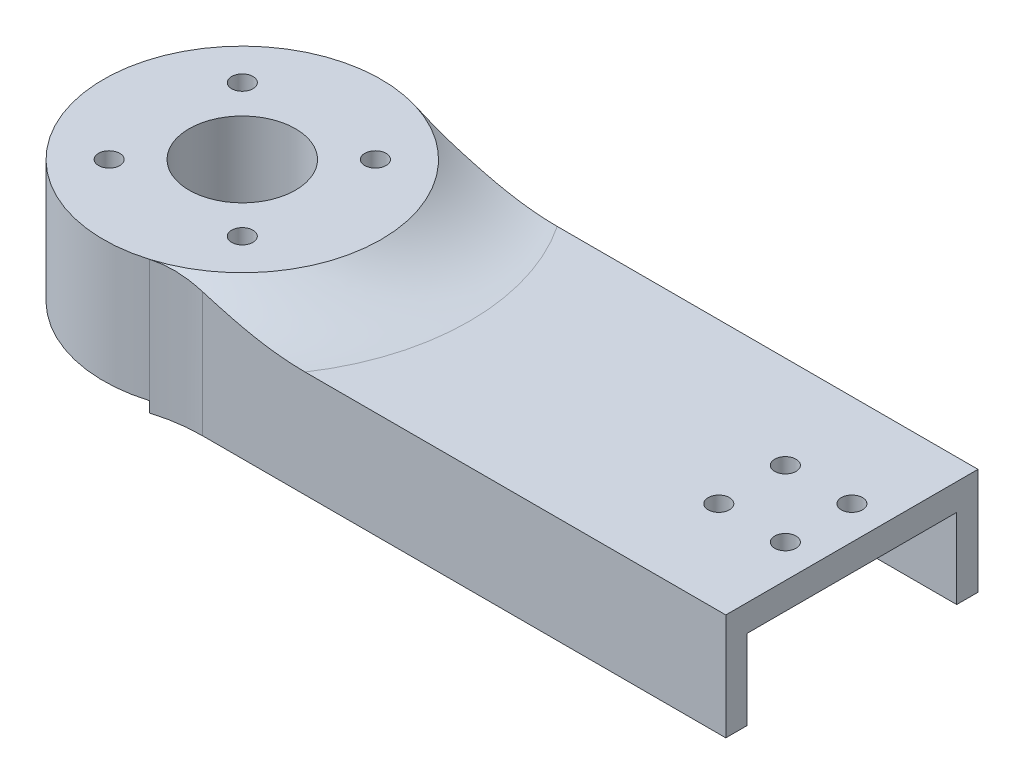
ISO-10303-21;
HEADER;
FILE_DESCRIPTION(('STEP AP214'),'2;1');
FILE_NAME('part.step','',(''),(''),'','','');
FILE_SCHEMA(('AUTOMOTIVE_DESIGN { 1 0 10303 214 1 1 1 1 }'));
ENDSEC;
DATA;
#1=APPLICATION_CONTEXT('core data for automotive mechanical design processes');
#2=APPLICATION_PROTOCOL_DEFINITION('international standard','automotive_design',2000,#1);
#3=PRODUCT_CONTEXT('',#1,'mechanical');
#4=PRODUCT('Part','Part','',(#3));
#5=PRODUCT_RELATED_PRODUCT_CATEGORY('part','',(#4));
#6=PRODUCT_DEFINITION_FORMATION('','',#4);
#7=PRODUCT_DEFINITION_CONTEXT('part definition',#1,'design');
#8=PRODUCT_DEFINITION('design','',#6,#7);
#9=PRODUCT_DEFINITION_SHAPE('','',#8);
#10=(LENGTH_UNIT() NAMED_UNIT(*) SI_UNIT(.MILLI.,.METRE.));
#11=(NAMED_UNIT(*) PLANE_ANGLE_UNIT() SI_UNIT($,.RADIAN.));
#12=(NAMED_UNIT(*) SI_UNIT($,.STERADIAN.) SOLID_ANGLE_UNIT());
#13=UNCERTAINTY_MEASURE_WITH_UNIT(LENGTH_MEASURE(1.E-05),#10,'distance_accuracy_value','');
#14=(GEOMETRIC_REPRESENTATION_CONTEXT(3) GLOBAL_UNCERTAINTY_ASSIGNED_CONTEXT((#13)) GLOBAL_UNIT_ASSIGNED_CONTEXT((#10,
#11,#12)) REPRESENTATION_CONTEXT('',''));
#15=CARTESIAN_POINT('',(0.,0.,0.));
#16=DIRECTION('',(0.,0.,1.));
#17=DIRECTION('',(1.,0.,0.));
#18=AXIS2_PLACEMENT_3D('',#15,#16,#17);
#19=CARTESIAN_POINT('',(0.,40.,0.));
#20=DIRECTION('',(0.,-1.,0.));
#21=DIRECTION('',(0.,0.,1.));
#22=AXIS2_PLACEMENT_3D('',#19,#20,#21);
#23=PLANE('',#22);
#24=CARTESIAN_POINT('',(-61.1993827291588,40.,0.));
#25=DIRECTION('',(0.,-1.,0.));
#26=DIRECTION('',(0.,0.,-1.));
#27=AXIS2_PLACEMENT_3D('',#24,#25,#26);
#28=CIRCLE('',#27,26.0715061656139);
#29=CARTESIAN_POINT('',(-53.6728775906691,40.,-24.9614733968956));
#30=VERTEX_POINT('',#29);
#31=CARTESIAN_POINT('',(-44.1038709714179,40.,-19.6841792179553));
#32=VERTEX_POINT('',#31);
#33=EDGE_CURVE('E140',#30,#32,#28,.T.);
#34=ORIENTED_EDGE('',*,*,#33,.F.);
#35=CARTESIAN_POINT('',(-45.0122673167412,40.,-53.6841792179553));
#36=DIRECTION('',(0.,1.,0.));
#37=DIRECTION('',(0.,0.,1.));
#38=AXIS2_PLACEMENT_3D('',#35,#36,#37);
#39=CIRCLE('',#38,30.);
#40=CARTESIAN_POINT('',(-45.0122673167412,40.,-23.6841792179553));
#41=VERTEX_POINT('',#40);
#42=EDGE_CURVE('E52',#41,#30,#39,.F.);
#43=ORIENTED_EDGE('',*,*,#42,.F.);
#44=DIRECTION('',(-1.,0.,0.));
#45=VECTOR('',#44,1.);
#46=CARTESIAN_POINT('',(-50.3006172708412,40.,-23.6841792179553));
#47=LINE('',#46,#45);
#48=CARTESIAN_POINT('',(53.3006172708412,40.,-23.6841792179553));
#49=VERTEX_POINT('',#48);
#50=EDGE_CURVE('E248',#49,#41,#47,.T.);
#51=ORIENTED_EDGE('',*,*,#50,.F.);
#52=DIRECTION('',(0.,0.,1.));
#53=VECTOR('',#52,1.);
#54=CARTESIAN_POINT('',(53.3006172708412,40.,-19.6841792179553));
#55=LINE('',#54,#53);
#56=CARTESIAN_POINT('',(53.3006172708412,40.,-19.6841792179553));
#57=VERTEX_POINT('',#56);
#58=EDGE_CURVE('E275',#49,#57,#55,.T.);
#59=ORIENTED_EDGE('',*,*,#58,.T.);
#60=DIRECTION('',(1.,0.,0.));
#61=VECTOR('',#60,1.);
#62=CARTESIAN_POINT('',(-50.3006172708412,40.,-19.6841792179553));
#63=LINE('',#62,#61);
#64=EDGE_CURVE('E153',#32,#57,#63,.T.);
#65=ORIENTED_EDGE('',*,*,#64,.F.);
#66=EDGE_LOOP('',(#34,#43,#51,#59,#65));
#67=FACE_BOUND('',#66,.T.);
#68=ADVANCED_FACE('F42',(#67),#23,.T.);
#69=CARTESIAN_POINT('',(-61.1993827291588,65.,0.));
#70=DIRECTION('',(0.,-1.,0.));
#71=DIRECTION('',(0.,0.,1.));
#72=AXIS2_PLACEMENT_3D('',#69,#70,#71);
#73=CYLINDRICAL_SURFACE('',#72,26.0715061656139);
#74=DIRECTION('',(0.,-1.,0.));
#75=VECTOR('',#74,1.);
#76=CARTESIAN_POINT('',(-53.6728775906691,65.,-24.9614733968957));
#77=LINE('',#76,#75);
#78=CARTESIAN_POINT('',(-53.6728775906691,42.,-24.9614733968957));
#79=VERTEX_POINT('',#78);
#80=CARTESIAN_POINT('',(-53.6728775906691,65.,-24.9614733968956));
#81=VERTEX_POINT('',#80);
#82=EDGE_CURVE('E145',#79,#81,#77,.F.);
#83=ORIENTED_EDGE('',*,*,#82,.F.);
#84=CARTESIAN_POINT('',(-61.1993827291588,42.,0.));
#85=DIRECTION('',(0.,-1.,0.));
#86=DIRECTION('',(0.,0.,-1.));
#87=AXIS2_PLACEMENT_3D('',#84,#85,#86);
#88=CIRCLE('',#87,26.0715061656139);
#89=CARTESIAN_POINT('',(-53.6728775906691,42.,24.9614733968956));
#90=VERTEX_POINT('',#89);
#91=EDGE_CURVE('E154',#90,#79,#88,.T.);
#92=ORIENTED_EDGE('',*,*,#91,.F.);
#93=DIRECTION('',(0.,-1.,0.));
#94=VECTOR('',#93,1.);
#95=CARTESIAN_POINT('',(-53.6728775906691,65.,24.9614733968956));
#96=LINE('',#95,#94);
#97=CARTESIAN_POINT('',(-53.6728775906691,65.,24.9614733968956));
#98=VERTEX_POINT('',#97);
#99=EDGE_CURVE('E226',#98,#90,#96,.T.);
#100=ORIENTED_EDGE('',*,*,#99,.F.);
#101=CARTESIAN_POINT('',(-61.1993827291588,65.,0.));
#102=DIRECTION('',(0.,1.,0.));
#103=DIRECTION('',(0.,0.,1.));
#104=AXIS2_PLACEMENT_3D('',#101,#102,#103);
#105=CIRCLE('',#104,26.0715061656139);
#106=EDGE_CURVE('E265',#81,#98,#105,.T.);
#107=ORIENTED_EDGE('',*,*,#106,.F.);
#108=EDGE_LOOP('',(#83,#92,#100,#107));
#109=FACE_BOUND('',#108,.T.);
#110=ADVANCED_FACE('F339',(#109),#73,.T.);
#111=DIRECTION('',(0.,-1.,0.));
#112=VECTOR('',#111,1.);
#113=CARTESIAN_POINT('',(-44.1038709714179,65.,19.6841792179553));
#114=LINE('',#113,#112);
#115=CARTESIAN_POINT('',(-44.1038709714179,42.,19.6841792179553));
#116=VERTEX_POINT('',#115);
#117=CARTESIAN_POINT('',(-44.1038709714179,55.,19.6841792179553));
#118=VERTEX_POINT('',#117);
#119=EDGE_CURVE('E256',#116,#118,#114,.F.);
#120=ORIENTED_EDGE('',*,*,#119,.F.);
#121=CARTESIAN_POINT('',(-44.1038709714179,42.,-19.6841792179553));
#122=VERTEX_POINT('',#121);
#123=EDGE_CURVE('E313',#122,#116,#88,.T.);
#124=ORIENTED_EDGE('',*,*,#123,.F.);
#125=DIRECTION('',(0.,-1.,0.));
#126=VECTOR('',#125,1.);
#127=CARTESIAN_POINT('',(-44.1038709714179,65.,-19.6841792179553));
#128=LINE('',#127,#126);
#129=CARTESIAN_POINT('',(-44.1038709714179,55.,-19.6841792179553));
#130=VERTEX_POINT('',#129);
#131=EDGE_CURVE('E259',#130,#122,#128,.T.);
#132=ORIENTED_EDGE('',*,*,#131,.F.);
#133=CARTESIAN_POINT('',(-61.1993827291588,55.,0.));
#134=DIRECTION('',(0.,1.,0.));
#135=DIRECTION('',(0.,0.,1.));
#136=AXIS2_PLACEMENT_3D('',#133,#134,#135);
#137=CIRCLE('',#136,26.0715061656139);
#138=EDGE_CURVE('E257',#118,#130,#137,.T.);
#139=ORIENTED_EDGE('',*,*,#138,.F.);
#140=EDGE_LOOP('',(#120,#124,#132,#139));
#141=FACE_BOUND('',#140,.T.);
#142=ADVANCED_FACE('F350',(#141),#73,.T.);
#143=CARTESIAN_POINT('',(-48.6993827291588,66.89954427596,-12.5));
#144=DIRECTION('',(0.,-1.,0.));
#145=DIRECTION('',(0.,0.,1.));
#146=AXIS2_PLACEMENT_3D('',#143,#144,#145);
#147=CYLINDRICAL_SURFACE('',#146,1.99999999999998);
#148=CARTESIAN_POINT('',(-48.6993827291588,65.,-12.5));
#149=DIRECTION('',(0.,1.,0.));
#150=DIRECTION('',(0.,0.,1.));
#151=AXIS2_PLACEMENT_3D('',#148,#149,#150);
#152=CIRCLE('',#151,1.99999999999998);
#153=CARTESIAN_POINT('',(-48.6993827291588,65.,-10.5));
#154=VERTEX_POINT('',#153);
#155=EDGE_CURVE('E741',#154,#154,#152,.T.);
#156=ORIENTED_EDGE('',*,*,#155,.T.);
#157=EDGE_LOOP('',(#156));
#158=FACE_BOUND('',#157,.T.);
#159=CARTESIAN_POINT('',(-48.6993827291588,42.,-12.5));
#160=DIRECTION('',(0.,-1.,0.));
#161=DIRECTION('',(0.,0.,-1.));
#162=AXIS2_PLACEMENT_3D('',#159,#160,#161);
#163=CIRCLE('',#162,1.99999999999998);
#164=CARTESIAN_POINT('',(-48.6993827291588,42.,-14.5));
#165=VERTEX_POINT('',#164);
#166=EDGE_CURVE('E303',#165,#165,#163,.F.);
#167=ORIENTED_EDGE('',*,*,#166,.F.);
#168=EDGE_LOOP('',(#167));
#169=FACE_BOUND('',#168,.T.);
#170=ADVANCED_FACE('F376',(#158,#169),#147,.F.);
#171=CARTESIAN_POINT('',(-48.6993827291588,66.89954427596,12.5));
#172=DIRECTION('',(0.,-1.,0.));
#173=DIRECTION('',(0.,0.,1.));
#174=AXIS2_PLACEMENT_3D('',#171,#172,#173);
#175=CYLINDRICAL_SURFACE('',#174,1.99999999999997);
#176=CARTESIAN_POINT('',(-48.6993827291588,65.,12.5));
#177=DIRECTION('',(0.,1.,0.));
#178=DIRECTION('',(0.,0.,1.));
#179=AXIS2_PLACEMENT_3D('',#176,#177,#178);
#180=CIRCLE('',#179,1.99999999999997);
#181=CARTESIAN_POINT('',(-48.6993827291588,65.,14.5));
#182=VERTEX_POINT('',#181);
#183=EDGE_CURVE('E744',#182,#182,#180,.T.);
#184=ORIENTED_EDGE('',*,*,#183,.T.);
#185=EDGE_LOOP('',(#184));
#186=FACE_BOUND('',#185,.T.);
#187=CARTESIAN_POINT('',(-48.6993827291588,42.,12.5));
#188=DIRECTION('',(0.,-1.,0.));
#189=DIRECTION('',(0.,0.,-1.));
#190=AXIS2_PLACEMENT_3D('',#187,#188,#189);
#191=CIRCLE('',#190,1.99999999999997);
#192=CARTESIAN_POINT('',(-48.6993827291588,42.,10.5));
#193=VERTEX_POINT('',#192);
#194=EDGE_CURVE('E306',#193,#193,#191,.F.);
#195=ORIENTED_EDGE('',*,*,#194,.F.);
#196=EDGE_LOOP('',(#195));
#197=FACE_BOUND('',#196,.T.);
#198=ADVANCED_FACE('F383',(#186,#197),#175,.F.);
#199=CARTESIAN_POINT('',(-73.6993827291588,66.89954427596,12.5));
#200=DIRECTION('',(0.,-1.,0.));
#201=DIRECTION('',(0.,0.,1.));
#202=AXIS2_PLACEMENT_3D('',#199,#200,#201);
#203=CYLINDRICAL_SURFACE('',#202,2.);
#204=CARTESIAN_POINT('',(-73.6993827291588,65.,12.5));
#205=DIRECTION('',(0.,1.,0.));
#206=DIRECTION('',(0.,0.,1.));
#207=AXIS2_PLACEMENT_3D('',#204,#205,#206);
#208=CIRCLE('',#207,2.);
#209=CARTESIAN_POINT('',(-73.6993827291588,65.,14.5));
#210=VERTEX_POINT('',#209);
#211=EDGE_CURVE('E748',#210,#210,#208,.T.);
#212=ORIENTED_EDGE('',*,*,#211,.T.);
#213=EDGE_LOOP('',(#212));
#214=FACE_BOUND('',#213,.T.);
#215=CARTESIAN_POINT('',(-73.6993827291588,42.,12.5));
#216=DIRECTION('',(0.,-1.,0.));
#217=DIRECTION('',(0.,0.,-1.));
#218=AXIS2_PLACEMENT_3D('',#215,#216,#217);
#219=CIRCLE('',#218,2.);
#220=CARTESIAN_POINT('',(-73.6993827291588,42.,10.5));
#221=VERTEX_POINT('',#220);
#222=EDGE_CURVE('E309',#221,#221,#219,.F.);
#223=ORIENTED_EDGE('',*,*,#222,.F.);
#224=EDGE_LOOP('',(#223));
#225=FACE_BOUND('',#224,.T.);
#226=ADVANCED_FACE('F387',(#214,#225),#203,.F.);
#227=CARTESIAN_POINT('',(-73.6993827291588,66.89954427596,-12.5));
#228=DIRECTION('',(0.,-1.,0.));
#229=DIRECTION('',(0.,0.,1.));
#230=AXIS2_PLACEMENT_3D('',#227,#228,#229);
#231=CYLINDRICAL_SURFACE('',#230,2.);
#232=CARTESIAN_POINT('',(-73.6993827291588,65.,-12.5));
#233=DIRECTION('',(0.,1.,0.));
#234=DIRECTION('',(0.,0.,1.));
#235=AXIS2_PLACEMENT_3D('',#232,#233,#234);
#236=CIRCLE('',#235,2.);
#237=CARTESIAN_POINT('',(-73.6993827291588,65.,-10.5));
#238=VERTEX_POINT('',#237);
#239=EDGE_CURVE('E284',#238,#238,#236,.T.);
#240=ORIENTED_EDGE('',*,*,#239,.T.);
#241=EDGE_LOOP('',(#240));
#242=FACE_BOUND('',#241,.T.);
#243=CARTESIAN_POINT('',(-73.6993827291588,42.,-12.5));
#244=DIRECTION('',(0.,-1.,0.));
#245=DIRECTION('',(0.,0.,-1.));
#246=AXIS2_PLACEMENT_3D('',#243,#244,#245);
#247=CIRCLE('',#246,2.);
#248=CARTESIAN_POINT('',(-73.6993827291588,42.,-14.5));
#249=VERTEX_POINT('',#248);
#250=EDGE_CURVE('E47',#249,#249,#247,.F.);
#251=ORIENTED_EDGE('',*,*,#250,.F.);
#252=EDGE_LOOP('',(#251));
#253=FACE_BOUND('',#252,.T.);
#254=ADVANCED_FACE('F196',(#242,#253),#231,.F.);
#255=CARTESIAN_POINT('',(0.,55.,0.));
#256=DIRECTION('',(0.,-1.,0.));
#257=DIRECTION('',(0.,0.,1.));
#258=AXIS2_PLACEMENT_3D('',#255,#256,#257);
#259=PLANE('',#258);
#260=CARTESIAN_POINT('',(34.5506172708412,55.,-6.25000000000001));
#261=DIRECTION('',(0.,-1.,0.));
#262=DIRECTION('',(0.,0.,1.));
#263=AXIS2_PLACEMENT_3D('',#260,#261,#262);
#264=CIRCLE('',#263,2.);
#265=CARTESIAN_POINT('',(34.5506172708412,55.,-4.25000000000001));
#266=VERTEX_POINT('',#265);
#267=EDGE_CURVE('E290',#266,#266,#264,.T.);
#268=ORIENTED_EDGE('',*,*,#267,.F.);
#269=EDGE_LOOP('',(#268));
#270=FACE_BOUND('',#269,.T.);
#271=CARTESIAN_POINT('',(47.0506172708412,55.,-6.25000000000001));
#272=DIRECTION('',(0.,-1.,0.));
#273=DIRECTION('',(0.,0.,-1.));
#274=AXIS2_PLACEMENT_3D('',#271,#272,#273);
#275=CIRCLE('',#274,2.);
#276=CARTESIAN_POINT('',(47.0506172708412,55.,-8.25));
#277=VERTEX_POINT('',#276);
#278=EDGE_CURVE('E293',#277,#277,#275,.T.);
#279=ORIENTED_EDGE('',*,*,#278,.F.);
#280=EDGE_LOOP('',(#279));
#281=FACE_BOUND('',#280,.T.);
#282=CARTESIAN_POINT('',(47.0506172708412,55.,6.25000000000001));
#283=DIRECTION('',(0.,-1.,0.));
#284=DIRECTION('',(0.,0.,1.));
#285=AXIS2_PLACEMENT_3D('',#282,#283,#284);
#286=CIRCLE('',#285,2.);
#287=CARTESIAN_POINT('',(47.0506172708412,55.,8.25));
#288=VERTEX_POINT('',#287);
#289=EDGE_CURVE('E289',#288,#288,#286,.T.);
#290=ORIENTED_EDGE('',*,*,#289,.F.);
#291=EDGE_LOOP('',(#290));
#292=FACE_BOUND('',#291,.T.);
#293=CARTESIAN_POINT('',(34.5506172708412,55.,6.25000000000001));
#294=DIRECTION('',(0.,-1.,0.));
#295=DIRECTION('',(0.,0.,-1.));
#296=AXIS2_PLACEMENT_3D('',#293,#294,#295);
#297=CIRCLE('',#296,2.);
#298=CARTESIAN_POINT('',(34.5506172708412,55.,4.25000000000001));
#299=VERTEX_POINT('',#298);
#300=EDGE_CURVE('E285',#299,#299,#297,.T.);
#301=ORIENTED_EDGE('',*,*,#300,.F.);
#302=EDGE_LOOP('',(#301));
#303=FACE_BOUND('',#302,.T.);
#304=ORIENTED_EDGE('',*,*,#138,.T.);
#305=DIRECTION('',(1.,0.,0.));
#306=VECTOR('',#305,1.);
#307=CARTESIAN_POINT('',(0.,55.,-19.6841792179553));
#308=LINE('',#307,#306);
#309=CARTESIAN_POINT('',(53.3006172708412,55.,-19.6841792179553));
#310=VERTEX_POINT('',#309);
#311=EDGE_CURVE('E235',#130,#310,#308,.T.);
#312=ORIENTED_EDGE('',*,*,#311,.T.);
#313=DIRECTION('',(0.,0.,1.));
#314=VECTOR('',#313,1.);
#315=CARTESIAN_POINT('',(53.3006172708412,55.,-19.6841792179553));
#316=LINE('',#315,#314);
#317=CARTESIAN_POINT('',(53.3006172708412,55.,19.6841792179553));
#318=VERTEX_POINT('',#317);
#319=EDGE_CURVE('E270',#310,#318,#316,.T.);
#320=ORIENTED_EDGE('',*,*,#319,.T.);
#321=DIRECTION('',(1.,0.,0.));
#322=VECTOR('',#321,1.);
#323=CARTESIAN_POINT('',(0.,55.,19.6841792179553));
#324=LINE('',#323,#322);
#325=EDGE_CURVE('E232',#118,#318,#324,.T.);
#326=ORIENTED_EDGE('',*,*,#325,.F.);
#327=EDGE_LOOP('',(#304,#312,#320,#326));
#328=FACE_BOUND('',#327,.T.);
#329=ADVANCED_FACE('F193',(#270,#281,#292,#303,#328),#259,.T.);
#330=CARTESIAN_POINT('',(0.,60.,0.));
#331=DIRECTION('',(0.,-1.,0.));
#332=DIRECTION('',(0.,0.,1.));
#333=AXIS2_PLACEMENT_3D('',#330,#331,#332);
#334=PLANE('',#333);
#335=CARTESIAN_POINT('',(34.5506172708412,60.,-6.25000000000001));
#336=DIRECTION('',(0.,-1.,0.));
#337=DIRECTION('',(0.,0.,-1.));
#338=AXIS2_PLACEMENT_3D('',#335,#336,#337);
#339=CIRCLE('',#338,2.);
#340=CARTESIAN_POINT('',(34.5506172708412,60.,-8.25));
#341=VERTEX_POINT('',#340);
#342=EDGE_CURVE('E732',#341,#341,#339,.T.);
#343=ORIENTED_EDGE('',*,*,#342,.T.);
#344=EDGE_LOOP('',(#343));
#345=FACE_BOUND('',#344,.T.);
#346=CARTESIAN_POINT('',(47.0506172708412,60.,-6.25000000000001));
#347=DIRECTION('',(0.,-1.,0.));
#348=DIRECTION('',(0.,0.,-1.));
#349=AXIS2_PLACEMENT_3D('',#346,#347,#348);
#350=CIRCLE('',#349,2.);
#351=CARTESIAN_POINT('',(47.0506172708412,60.,-8.25));
#352=VERTEX_POINT('',#351);
#353=EDGE_CURVE('E729',#352,#352,#350,.T.);
#354=ORIENTED_EDGE('',*,*,#353,.T.);
#355=EDGE_LOOP('',(#354));
#356=FACE_BOUND('',#355,.T.);
#357=CARTESIAN_POINT('',(47.0506172708412,60.,6.25000000000001));
#358=DIRECTION('',(0.,-1.,0.));
#359=DIRECTION('',(0.,0.,-1.));
#360=AXIS2_PLACEMENT_3D('',#357,#358,#359);
#361=CIRCLE('',#360,2.);
#362=CARTESIAN_POINT('',(47.0506172708412,60.,4.25000000000001));
#363=VERTEX_POINT('',#362);
#364=EDGE_CURVE('E727',#363,#363,#361,.T.);
#365=ORIENTED_EDGE('',*,*,#364,.T.);
#366=EDGE_LOOP('',(#365));
#367=FACE_BOUND('',#366,.T.);
#368=CARTESIAN_POINT('',(34.5506172708412,60.,6.25000000000001));
#369=DIRECTION('',(0.,-1.,0.));
#370=DIRECTION('',(0.,0.,-1.));
#371=AXIS2_PLACEMENT_3D('',#368,#369,#370);
#372=CIRCLE('',#371,2.);
#373=CARTESIAN_POINT('',(34.5506172708412,60.,4.25000000000001));
#374=VERTEX_POINT('',#373);
#375=EDGE_CURVE('E288',#374,#374,#372,.T.);
#376=ORIENTED_EDGE('',*,*,#375,.T.);
#377=EDGE_LOOP('',(#376));
#378=FACE_BOUND('',#377,.T.);
#379=DIRECTION('',(-1.,0.,0.));
#380=VECTOR('',#379,1.);
#381=CARTESIAN_POINT('',(-50.3006172708412,60.,23.6841792179553));
#382=LINE('',#381,#380);
#383=CARTESIAN_POINT('',(53.3006172708412,60.,23.6841792179553));
#384=VERTEX_POINT('',#383);
#385=CARTESIAN_POINT('',(-25.7243615843702,60.,23.6841792179553));
#386=VERTEX_POINT('',#385);
#387=EDGE_CURVE('E238',#384,#386,#382,.T.);
#388=ORIENTED_EDGE('',*,*,#387,.F.);
#389=DIRECTION('',(0.,0.,-1.));
#390=VECTOR('',#389,1.);
#391=CARTESIAN_POINT('',(53.3006172708412,60.,-23.6841792179553));
#392=LINE('',#391,#390);
#393=CARTESIAN_POINT('',(53.3006172708412,60.,-23.6841792179553));
#394=VERTEX_POINT('',#393);
#395=EDGE_CURVE('E279',#384,#394,#392,.T.);
#396=ORIENTED_EDGE('',*,*,#395,.T.);
#397=DIRECTION('',(1.,0.,0.));
#398=VECTOR('',#397,1.);
#399=CARTESIAN_POINT('',(-50.3006172708412,60.,-23.6841792179553));
#400=LINE('',#399,#398);
#401=CARTESIAN_POINT('',(-25.7243615843702,60.,-23.6841792179553));
#402=VERTEX_POINT('',#401);
#403=EDGE_CURVE('E250',#402,#394,#400,.T.);
#404=ORIENTED_EDGE('',*,*,#403,.F.);
#405=CARTESIAN_POINT('',(-61.1993827291588,60.,0.));
#406=DIRECTION('',(0.,1.,0.));
#407=DIRECTION('',(0.,0.,1.));
#408=AXIS2_PLACEMENT_3D('',#405,#406,#407);
#409=CIRCLE('',#408,42.6546301173908);
#410=EDGE_CURVE('E229',#386,#402,#409,.T.);
#411=ORIENTED_EDGE('',*,*,#410,.F.);
#412=EDGE_LOOP('',(#388,#396,#404,#411));
#413=FACE_BOUND('',#412,.T.);
#414=ADVANCED_FACE('F189',(#345,#356,#367,#378,#413),#334,.F.);
#415=CARTESIAN_POINT('',(-50.3006172708412,160.680725023763,19.6841792179553));
#416=DIRECTION('',(0.,0.,-1.));
#417=DIRECTION('',(-1.,0.,0.));
#418=AXIS2_PLACEMENT_3D('',#415,#416,#417);
#419=PLANE('',#418);
#420=CARTESIAN_POINT('',(-44.1038709714179,40.,19.6841792179553));
#421=VERTEX_POINT('',#420);
#422=EDGE_CURVE('E253',#421,#116,#114,.F.);
#423=ORIENTED_EDGE('',*,*,#422,.T.);
#424=ORIENTED_EDGE('',*,*,#119,.T.);
#425=ORIENTED_EDGE('',*,*,#325,.T.);
#426=DIRECTION('',(0.,-1.,0.));
#427=VECTOR('',#426,1.);
#428=CARTESIAN_POINT('',(53.3006172708412,55.,19.6841792179553));
#429=LINE('',#428,#427);
#430=CARTESIAN_POINT('',(53.3006172708412,40.,19.6841792179553));
#431=VERTEX_POINT('',#430);
#432=EDGE_CURVE('E267',#318,#431,#429,.T.);
#433=ORIENTED_EDGE('',*,*,#432,.T.);
#434=DIRECTION('',(-1.,0.,0.));
#435=VECTOR('',#434,1.);
#436=CARTESIAN_POINT('',(-50.3006172708412,40.,19.6841792179553));
#437=LINE('',#436,#435);
#438=EDGE_CURVE('E241',#431,#421,#437,.T.);
#439=ORIENTED_EDGE('',*,*,#438,.T.);
#440=EDGE_LOOP('',(#423,#424,#425,#433,#439));
#441=FACE_BOUND('',#440,.T.);
#442=ADVANCED_FACE('F192',(#441),#419,.T.);
#443=CARTESIAN_POINT('',(-50.3006172708412,160.680725023763,23.6841792179553));
#444=DIRECTION('',(0.,0.,1.));
#445=DIRECTION('',(1.,0.,0.));
#446=AXIS2_PLACEMENT_3D('',#443,#444,#445);
#447=PLANE('',#446);
#448=DIRECTION('',(1.,0.,0.));
#449=VECTOR('',#448,1.);
#450=CARTESIAN_POINT('',(-50.3006172708412,40.,23.6841792179553));
#451=LINE('',#450,#449);
#452=CARTESIAN_POINT('',(-45.0122673167412,40.,23.6841792179553));
#453=VERTEX_POINT('',#452);
#454=CARTESIAN_POINT('',(53.3006172708412,40.,23.6841792179553));
#455=VERTEX_POINT('',#454);
#456=EDGE_CURVE('E244',#453,#455,#451,.T.);
#457=ORIENTED_EDGE('',*,*,#456,.T.);
#458=DIRECTION('',(0.,1.,0.));
#459=VECTOR('',#458,1.);
#460=CARTESIAN_POINT('',(53.3006172708412,40.,23.6841792179553));
#461=LINE('',#460,#459);
#462=EDGE_CURVE('E282',#455,#384,#461,.T.);
#463=ORIENTED_EDGE('',*,*,#462,.T.);
#464=ORIENTED_EDGE('',*,*,#387,.T.);
#465=CARTESIAN_POINT('',(-45.0122673167412,63.44977213798,23.6841792179553));
#466=CARTESIAN_POINT('',(-44.6192726525285,63.3330985302591,23.6841792179553));
#467=CARTESIAN_POINT('',(-44.2260859453502,63.2170526330568,23.6841792179553));
#468=CARTESIAN_POINT('',(-43.4390413836686,62.9871885159317,23.6841792179553));
#469=CARTESIAN_POINT('',(-43.0451834963289,62.8733704086117,23.6841792179553));
#470=CARTESIAN_POINT('',(-42.2563710426375,62.6488954229166,23.6841792179553));
#471=CARTESIAN_POINT('',(-41.8614160614097,62.5382399951018,23.6841792179553));
#472=CARTESIAN_POINT('',(-41.0703881877655,62.3210283304441,23.6841792179553));
#473=CARTESIAN_POINT('',(-40.6743153119205,62.2144720331757,23.6841792179553));
#474=CARTESIAN_POINT('',(-39.4886507196752,61.9033880172231,23.6841792179553));
#475=CARTESIAN_POINT('',(-38.6971181429842,61.7061458279795,23.6841792179553));
#476=CARTESIAN_POINT('',(-37.1081905015349,61.3370688181104,23.6841792179553));
#477=CARTESIAN_POINT('',(-36.3107960852291,61.165231230269,23.6841792179553));
#478=CARTESIAN_POINT('',(-34.7068378251916,60.8514672907077,23.6841792179553));
#479=CARTESIAN_POINT('',(-33.9002503130536,60.7096605892484,23.6841792179553));
#480=CARTESIAN_POINT('',(-32.2816780287592,60.461456274718,23.6841792179553));
#481=CARTESIAN_POINT('',(-31.4696937923723,60.3550551987046,23.6841792179553));
#482=CARTESIAN_POINT('',(-29.8369465462242,60.1812899452092,23.6841792179553));
#483=CARTESIAN_POINT('',(-29.0161598136713,60.1141431023916,23.6841792179553));
#484=CARTESIAN_POINT('',(-27.7829992867439,60.0461548393226,23.6841792179553));
#485=CARTESIAN_POINT('',(-27.3714857290008,60.0289471597951,23.6841792179553));
#486=CARTESIAN_POINT('',(-26.5481115601096,60.005867968815,23.6841792179553));
#487=CARTESIAN_POINT('',(-26.136250925082,59.9999973142462,23.6841792179553));
#488=CARTESIAN_POINT('',(-25.7243615843702,60.,23.6841792179553));
#489=B_SPLINE_CURVE_WITH_KNOTS('',3,(#465,#466,#467,#468,#469,#470,#471,#472,#473,#474,#475,
#476,#477,#478,#479,#480,#481,#482,#483,#484,#485,#486,#487,#488),.UNSPECIFIED.,.F.,.F.,(4,2,2,
2,2,2,2,2,2,2,2,4),(0.,1.22985238891317,2.45976678052894,3.69023650232134,4.92068807869775,
7.36755769608009,9.81416058962096,12.270335200046,14.7262695070534,17.1956756018388,
18.4311574781634,19.6667327319867),.UNSPECIFIED.);
#490=CARTESIAN_POINT('',(-45.0122673167412,63.44977213798,23.6841792179553));
#491=VERTEX_POINT('',#490);
#492=EDGE_CURVE('E160',#491,#386,#489,.T.);
#493=ORIENTED_EDGE('',*,*,#492,.F.);
#494=DIRECTION('',(0.,1.,0.));
#495=VECTOR('',#494,1.);
#496=CARTESIAN_POINT('',(-45.0122673167412,60.,23.6841792179553));
#497=LINE('',#496,#495);
#498=EDGE_CURVE('E223',#453,#491,#497,.T.);
#499=ORIENTED_EDGE('',*,*,#498,.F.);
#500=EDGE_LOOP('',(#457,#463,#464,#493,#499));
#501=FACE_BOUND('',#500,.T.);
#502=ADVANCED_FACE('F198',(#501),#447,.T.);
#503=CARTESIAN_POINT('',(-53.6728775906691,40.,24.9614733968956));
#504=VERTEX_POINT('',#503);
#505=EDGE_CURVE('E155',#421,#504,#28,.T.);
#506=ORIENTED_EDGE('',*,*,#505,.F.);
#507=ORIENTED_EDGE('',*,*,#438,.F.);
#508=DIRECTION('',(0.,0.,1.));
#509=VECTOR('',#508,1.);
#510=CARTESIAN_POINT('',(53.3006172708412,40.,23.6841792179553));
#511=LINE('',#510,#509);
#512=EDGE_CURVE('E178',#431,#455,#511,.T.);
#513=ORIENTED_EDGE('',*,*,#512,.T.);
#514=ORIENTED_EDGE('',*,*,#456,.F.);
#515=CARTESIAN_POINT('',(-45.0122673167412,40.,53.6841792179553));
#516=DIRECTION('',(0.,1.,0.));
#517=DIRECTION('',(0.,0.,1.));
#518=AXIS2_PLACEMENT_3D('',#515,#516,#517);
#519=CIRCLE('',#518,30.);
#520=EDGE_CURVE('E11',#504,#453,#519,.F.);
#521=ORIENTED_EDGE('',*,*,#520,.F.);
#522=EDGE_LOOP('',(#506,#507,#513,#514,#521));
#523=FACE_BOUND('',#522,.T.);
#524=ADVANCED_FACE('F202',(#523),#23,.T.);
#525=CARTESIAN_POINT('',(-50.3006172708412,160.680725023763,-23.6841792179553));
#526=DIRECTION('',(0.,0.,-1.));
#527=DIRECTION('',(-1.,0.,0.));
#528=AXIS2_PLACEMENT_3D('',#525,#526,#527);
#529=PLANE('',#528);
#530=CARTESIAN_POINT('',(-25.7243615843702,60.,-23.6841792179553));
#531=CARTESIAN_POINT('',(-26.090913515571,59.9999983265934,-23.6841792179553));
#532=CARTESIAN_POINT('',(-26.4574456721125,60.0046471803026,-23.6841792179553));
#533=CARTESIAN_POINT('',(-27.190265883014,60.0229602847633,-23.6841792179553));
#534=CARTESIAN_POINT('',(-27.5565539495754,60.0366240447519,-23.6841792179553));
#535=CARTESIAN_POINT('',(-28.6544440659323,60.0906922480933,-23.6841792179553));
#536=CARTESIAN_POINT('',(-29.3854338586261,60.144174180253,-23.6841792179553));
#537=CARTESIAN_POINT('',(-30.8416994494324,60.2832138543083,-23.6841792179553));
#538=CARTESIAN_POINT('',(-31.5669862947795,60.3686585183384,-23.6841792179553));
#539=CARTESIAN_POINT('',(-33.013558883051,60.5688214264915,-23.6841792179553));
#540=CARTESIAN_POINT('',(-33.7348441881866,60.6835428115308,-23.6841792179553));
#541=CARTESIAN_POINT('',(-35.1682574979355,60.9383173863146,-23.6841792179553));
#542=CARTESIAN_POINT('',(-35.880414555434,61.0782085954653,-23.6841792179553));
#543=CARTESIAN_POINT('',(-37.299972221724,61.3803826265997,-23.6841792179553));
#544=CARTESIAN_POINT('',(-38.0073725273881,61.5426668616759,-23.6841792179553));
#545=CARTESIAN_POINT('',(-39.4180202693663,61.8859056511023,-23.6841792179553));
#546=CARTESIAN_POINT('',(-40.1212650973101,62.0668708372881,-23.6841792179553));
#547=CARTESIAN_POINT('',(-41.523882577995,62.4431112233647,-23.6841792179553));
#548=CARTESIAN_POINT('',(-42.22325524995,62.6383863521801,-23.6841792179553));
#549=CARTESIAN_POINT('',(-43.0957282404846,62.8883562753702,-23.6841792179553));
#550=CARTESIAN_POINT('',(-43.2701103675914,62.9386366802749,-23.6841792179553));
#551=CARTESIAN_POINT('',(-43.6187047988102,63.0396925910213,-23.6841792179553));
#552=CARTESIAN_POINT('',(-43.7929171234953,63.0904680256535,-23.6841792179553));
#553=CARTESIAN_POINT('',(-44.1413613123788,63.1924775358615,-23.6841792179553));
#554=CARTESIAN_POINT('',(-44.3155930768467,63.2437119514172,-23.6841792179553));
#555=CARTESIAN_POINT('',(-44.6639841205901,63.3465153861382,-23.6841792179553));
#556=CARTESIAN_POINT('',(-44.838143386488,63.3980844506534,-23.6841792179553));
#557=CARTESIAN_POINT('',(-45.0122673167412,63.44977213798,-23.6841792179553));
#558=B_SPLINE_CURVE_WITH_KNOTS('',3,(#530,#531,#532,#533,#534,#535,#536,#537,#538,#539,#540,
#541,#542,#543,#544,#545,#546,#547,#548,#549,#550,#551,#552,#553,#554,#555,#556,#557),
.UNSPECIFIED.,.F.,.F.,(4,2,2,2,2,2,2,2,2,2,2,2,2,4),(0.,1.09959081538962,2.19912177505436,
4.39709937132342,6.58737338628432,8.77788248091214,10.954768378681,13.1317917098242,
15.3100609472348,17.4883193662648,18.0327784432568,18.5771603231304,19.1219857491709,
19.6668866166988),.UNSPECIFIED.);
#559=CARTESIAN_POINT('',(-45.0122673167412,63.44977213798,-23.6841792179553));
#560=VERTEX_POINT('',#559);
#561=EDGE_CURVE('E162',#402,#560,#558,.T.);
#562=ORIENTED_EDGE('',*,*,#561,.F.);
#563=ORIENTED_EDGE('',*,*,#403,.T.);
#564=DIRECTION('',(0.,-1.,0.));
#565=VECTOR('',#564,1.);
#566=CARTESIAN_POINT('',(53.3006172708412,60.,-23.6841792179553));
#567=LINE('',#566,#565);
#568=EDGE_CURVE('E277',#394,#49,#567,.T.);
#569=ORIENTED_EDGE('',*,*,#568,.T.);
#570=ORIENTED_EDGE('',*,*,#50,.T.);
#571=DIRECTION('',(0.,1.,0.));
#572=VECTOR('',#571,1.);
#573=CARTESIAN_POINT('',(-45.0122673167412,40.,-23.6841792179553));
#574=LINE('',#573,#572);
#575=EDGE_CURVE('E144',#560,#41,#574,.F.);
#576=ORIENTED_EDGE('',*,*,#575,.F.);
#577=EDGE_LOOP('',(#562,#563,#569,#570,#576));
#578=FACE_BOUND('',#577,.T.);
#579=ADVANCED_FACE('F209',(#578),#529,.T.);
#580=CARTESIAN_POINT('',(-50.3006172708412,160.680725023763,-19.6841792179553));
#581=DIRECTION('',(0.,0.,1.));
#582=DIRECTION('',(1.,0.,0.));
#583=AXIS2_PLACEMENT_3D('',#580,#581,#582);
#584=PLANE('',#583);
#585=ORIENTED_EDGE('',*,*,#131,.T.);
#586=DIRECTION('',(0.,-1.,0.));
#587=VECTOR('',#586,1.);
#588=CARTESIAN_POINT('',(-44.1038709714179,42.,-19.6841792179553));
#589=LINE('',#588,#587);
#590=EDGE_CURVE('E294',#32,#122,#589,.F.);
#591=ORIENTED_EDGE('',*,*,#590,.F.);
#592=ORIENTED_EDGE('',*,*,#64,.T.);
#593=DIRECTION('',(0.,1.,0.));
#594=VECTOR('',#593,1.);
#595=CARTESIAN_POINT('',(53.3006172708412,55.,-19.6841792179553));
#596=LINE('',#595,#594);
#597=EDGE_CURVE('E273',#57,#310,#596,.T.);
#598=ORIENTED_EDGE('',*,*,#597,.T.);
#599=ORIENTED_EDGE('',*,*,#311,.F.);
#600=EDGE_LOOP('',(#585,#591,#592,#598,#599));
#601=FACE_BOUND('',#600,.T.);
#602=ADVANCED_FACE('F214',(#601),#584,.T.);
#603=CARTESIAN_POINT('',(-61.1993827291588,65.,0.));
#604=DIRECTION('',(0.,-1.,0.));
#605=DIRECTION('',(0.,0.,1.));
#606=AXIS2_PLACEMENT_3D('',#603,#604,#605);
#607=PLANE('',#606);
#608=CARTESIAN_POINT('',(-61.1993827291588,65.,0.));
#609=DIRECTION('',(0.,-1.,0.));
#610=DIRECTION('',(0.,0.,-1.));
#611=AXIS2_PLACEMENT_3D('',#608,#609,#610);
#612=CIRCLE('',#611,10.);
#613=CARTESIAN_POINT('',(-61.1993827291588,65.,-10.));
#614=VERTEX_POINT('',#613);
#615=EDGE_CURVE('E738',#614,#614,#612,.T.);
#616=ORIENTED_EDGE('',*,*,#615,.T.);
#617=EDGE_LOOP('',(#616));
#618=FACE_BOUND('',#617,.T.);
#619=ORIENTED_EDGE('',*,*,#239,.F.);
#620=EDGE_LOOP('',(#619));
#621=FACE_BOUND('',#620,.T.);
#622=ORIENTED_EDGE('',*,*,#211,.F.);
#623=EDGE_LOOP('',(#622));
#624=FACE_BOUND('',#623,.T.);
#625=ORIENTED_EDGE('',*,*,#183,.F.);
#626=EDGE_LOOP('',(#625));
#627=FACE_BOUND('',#626,.T.);
#628=ORIENTED_EDGE('',*,*,#155,.F.);
#629=EDGE_LOOP('',(#628));
#630=FACE_BOUND('',#629,.T.);
#631=EDGE_CURVE('E262',#98,#81,#105,.T.);
#632=ORIENTED_EDGE('',*,*,#631,.T.);
#633=ORIENTED_EDGE('',*,*,#106,.T.);
#634=EDGE_LOOP('',(#632,#633));
#635=FACE_BOUND('',#634,.T.);
#636=ADVANCED_FACE('F335',(#618,#621,#624,#627,#630,#635),#607,.F.);
#637=CARTESIAN_POINT('',(-45.0122673167412,65.,53.6841792179553));
#638=DIRECTION('',(0.,-1.,0.));
#639=DIRECTION('',(0.,0.,1.));
#640=AXIS2_PLACEMENT_3D('',#637,#638,#639);
#641=CYLINDRICAL_SURFACE('',#640,30.);
#642=ORIENTED_EDGE('',*,*,#520,.T.);
#643=ORIENTED_EDGE('',*,*,#498,.T.);
#644=CARTESIAN_POINT('',(-53.6728775906691,65.,24.9614733968956));
#645=CARTESIAN_POINT('',(-53.5262229932828,65.0000032217323,24.9172529062308));
#646=CARTESIAN_POINT('',(-53.3792364807609,64.9983259285675,24.8741587347798));
#647=CARTESIAN_POINT('',(-53.0846947247245,64.9916396289383,24.7902462806881));
#648=CARTESIAN_POINT('',(-52.9371394960552,64.9866307088617,24.7494279390658));
#649=CARTESIAN_POINT('',(-52.4938708396309,64.966655707067,24.6304500935258));
#650=CARTESIAN_POINT('',(-52.1974363165896,64.9467413382109,24.5557321604273));
#651=CARTESIAN_POINT('',(-51.6042922967412,64.8943794066328,24.4158033600544));
#652=CARTESIAN_POINT('',(-51.30758561352,64.8619652185837,24.3505678080038));
#653=CARTESIAN_POINT('',(-50.7137730917237,64.7855394508247,24.2293886067881));
#654=CARTESIAN_POINT('',(-50.4166672290664,64.7415271369798,24.1734455461822));
#655=CARTESIAN_POINT('',(-49.5341110748173,64.5952207356062,24.0209722975575));
#656=CARTESIAN_POINT('',(-48.9488043741991,64.4778318899487,23.9377779959906));
#657=CARTESIAN_POINT('',(-47.7811677105468,64.2128220987567,23.8064485064388));
#658=CARTESIAN_POINT('',(-47.1988386807143,64.0651922075001,23.7583237117441));
#659=CARTESIAN_POINT('',(-46.4844199454719,63.8714641036099,23.7200213191832));
#660=CARTESIAN_POINT('',(-46.3505119996844,63.8346044343837,23.7137432262738));
#661=CARTESIAN_POINT('',(-46.0829141848353,63.7599695909446,23.7029910323478));
#662=CARTESIAN_POINT('',(-45.9492242655337,63.7221946738538,23.6985164307621));
#663=CARTESIAN_POINT('',(-45.6815708306486,63.6457122575541,23.6913464626942));
#664=CARTESIAN_POINT('',(-45.5476079410374,63.6070020128708,23.6886572278268));
#665=CARTESIAN_POINT('',(-45.27982403752,63.5288808914625,23.6850734831536));
#666=CARTESIAN_POINT('',(-45.1460030704397,63.48946983236,23.6841794476298));
#667=CARTESIAN_POINT('',(-45.0122673167412,63.44977213798,23.6841792179553));
#668=B_SPLINE_CURVE_WITH_KNOTS('',3,(#644,#645,#646,#647,#648,#649,#650,#651,#652,#653,#654,
#655,#656,#657,#658,#659,#660,#661,#662,#663,#664,#665,#666,#667),.UNSPECIFIED.,.F.,.F.,(4,2,2,
2,2,2,2,2,2,2,2,4),(0.,0.459501187289898,0.918990460335759,1.83759935582907,2.75377234890026,
3.67000334758366,5.47590240028774,7.28233643651149,7.69942349018413,8.11639469917825,
8.53479063509315,8.95329709441512),.UNSPECIFIED.);
#669=EDGE_CURVE('E68',#491,#98,#668,.F.);
#670=ORIENTED_EDGE('',*,*,#669,.T.);
#671=ORIENTED_EDGE('',*,*,#99,.T.);
#672=DIRECTION('',(0.,-1.,0.));
#673=VECTOR('',#672,1.);
#674=CARTESIAN_POINT('',(-53.6728775906691,41.,24.9614733968956));
#675=LINE('',#674,#673);
#676=EDGE_CURVE('E300',#90,#504,#675,.T.);
#677=ORIENTED_EDGE('',*,*,#676,.T.);
#678=EDGE_LOOP('',(#642,#643,#670,#671,#677));
#679=FACE_BOUND('',#678,.T.);
#680=ADVANCED_FACE('F44',(#679),#641,.F.);
#681=CARTESIAN_POINT('',(-45.0122673167412,65.,-53.6841792179553));
#682=DIRECTION('',(0.,-1.,0.));
#683=DIRECTION('',(0.,0.,1.));
#684=AXIS2_PLACEMENT_3D('',#681,#682,#683);
#685=CYLINDRICAL_SURFACE('',#684,30.);
#686=ORIENTED_EDGE('',*,*,#575,.T.);
#687=ORIENTED_EDGE('',*,*,#42,.T.);
#688=EDGE_CURVE('E137',#30,#79,#77,.F.);
#689=ORIENTED_EDGE('',*,*,#688,.T.);
#690=ORIENTED_EDGE('',*,*,#82,.T.);
#691=CARTESIAN_POINT('',(-45.0122673167412,63.44977213798,-23.6841792179553));
#692=CARTESIAN_POINT('',(-45.3237986774209,63.5422296216259,-23.6841888739963));
#693=CARTESIAN_POINT('',(-45.635751714934,63.6331482084957,-23.689032604883));
#694=CARTESIAN_POINT('',(-46.2607602371345,63.8104026472575,-23.7085354323391));
#695=CARTESIAN_POINT('',(-46.5738160573756,63.896736947267,-23.7231978301684));
#696=CARTESIAN_POINT('',(-47.5171479656498,64.147158657805,-23.7822817667348));
#697=CARTESIAN_POINT('',(-48.1491702200896,64.3019223894962,-23.8418025377377));
#698=CARTESIAN_POINT('',(-49.0924786044831,64.5037164395166,-23.9613012595088));
#699=CARTESIAN_POINT('',(-49.4027191166616,64.5654008141773,-24.0055209071907));
#700=CARTESIAN_POINT('',(-50.0235399919607,64.6780028384077,-24.1040189705773));
#701=CARTESIAN_POINT('',(-50.3341202860613,64.7289223713385,-24.1582956236372));
#702=CARTESIAN_POINT('',(-50.9545413207049,64.8184961518717,-24.2768850273052));
#703=CARTESIAN_POINT('',(-51.2643823784673,64.8571725536842,-24.3411793323818));
#704=CARTESIAN_POINT('',(-51.8831326201508,64.9212026741748,-24.4798701443354));
#705=CARTESIAN_POINT('',(-52.1920420323943,64.9465599750508,-24.5542639281572));
#706=CARTESIAN_POINT('',(-52.5980452248814,64.9706775149781,-24.658910436717));
#707=CARTESIAN_POINT('',(-52.6959582073799,64.9757842667026,-24.684676555183));
#708=CARTESIAN_POINT('',(-52.8915822483302,64.9845548294111,-24.7372165029565));
#709=CARTESIAN_POINT('',(-52.9892933037737,64.9882186190487,-24.7639903471654));
#710=CARTESIAN_POINT('',(-53.1848103521898,64.9940992996018,-24.8186309167697));
#711=CARTESIAN_POINT('',(-53.2826155419872,64.9963112379625,-24.8465010427275));
#712=CARTESIAN_POINT('',(-53.4779560392439,64.9992619929177,-24.9032400261939));
#713=CARTESIAN_POINT('',(-53.5754913518265,65.0000008376711,-24.9321088646009));
#714=CARTESIAN_POINT('',(-53.6728775906691,65.,-24.9614733968956));
#715=B_SPLINE_CURVE_WITH_KNOTS('',3,(#691,#692,#693,#694,#695,#696,#697,#698,#699,#700,#701,
#702,#703,#704,#705,#706,#707,#708,#709,#710,#711,#712,#713,#714),.UNSPECIFIED.,.F.,.F.,(4,2,2,
2,2,2,2,2,2,2,2,4),(0.,0.974765268741124,1.94985844047119,3.90761906715056,4.86552123841177,
5.82325568111478,6.77924704264199,7.73498115662341,8.0390967908243,8.34321692378021,
8.64836915297762,8.95351554899486),.UNSPECIFIED.);
#716=EDGE_CURVE('E171',#81,#560,#715,.F.);
#717=ORIENTED_EDGE('',*,*,#716,.T.);
#718=EDGE_LOOP('',(#686,#687,#689,#690,#717));
#719=FACE_BOUND('',#718,.T.);
#720=ADVANCED_FACE('F157',(#719),#685,.F.);
#721=CARTESIAN_POINT('',(-61.1993827291588,90.,0.));
#722=DIRECTION('',(0.,-1.,0.));
#723=DIRECTION('',(0.,0.,1.));
#724=AXIS2_PLACEMENT_3D('',#721,#722,#723);
#725=TOROIDAL_SURFACE('',#724,42.6546301173908,30.);
#726=ORIENTED_EDGE('',*,*,#669,.F.);
#727=ORIENTED_EDGE('',*,*,#492,.T.);
#728=ORIENTED_EDGE('',*,*,#410,.T.);
#729=ORIENTED_EDGE('',*,*,#561,.T.);
#730=ORIENTED_EDGE('',*,*,#716,.F.);
#731=ORIENTED_EDGE('',*,*,#631,.F.);
#732=EDGE_LOOP('',(#726,#727,#728,#729,#730,#731));
#733=FACE_BOUND('',#732,.T.);
#734=ADVANCED_FACE('F184',(#733),#725,.F.);
#735=CARTESIAN_POINT('',(53.3006172708412,60.,0.));
#736=DIRECTION('',(-1.,0.,0.));
#737=DIRECTION('',(0.,0.,1.));
#738=AXIS2_PLACEMENT_3D('',#735,#736,#737);
#739=PLANE('',#738);
#740=ORIENTED_EDGE('',*,*,#462,.F.);
#741=ORIENTED_EDGE('',*,*,#512,.F.);
#742=ORIENTED_EDGE('',*,*,#432,.F.);
#743=ORIENTED_EDGE('',*,*,#319,.F.);
#744=ORIENTED_EDGE('',*,*,#597,.F.);
#745=ORIENTED_EDGE('',*,*,#58,.F.);
#746=ORIENTED_EDGE('',*,*,#568,.F.);
#747=ORIENTED_EDGE('',*,*,#395,.F.);
#748=EDGE_LOOP('',(#740,#741,#742,#743,#744,#745,#746,#747));
#749=FACE_BOUND('',#748,.T.);
#750=ADVANCED_FACE('F354',(#749),#739,.F.);
#751=CARTESIAN_POINT('',(-61.1993827291588,66.89954427596,0.));
#752=DIRECTION('',(0.,-1.,0.));
#753=DIRECTION('',(0.,0.,-1.));
#754=AXIS2_PLACEMENT_3D('',#751,#752,#753);
#755=CYLINDRICAL_SURFACE('',#754,10.);
#756=ORIENTED_EDGE('',*,*,#615,.F.);
#757=EDGE_LOOP('',(#756));
#758=FACE_BOUND('',#757,.T.);
#759=CARTESIAN_POINT('',(-61.1993827291588,42.,0.));
#760=DIRECTION('',(0.,-1.,0.));
#761=DIRECTION('',(0.,0.,-1.));
#762=AXIS2_PLACEMENT_3D('',#759,#760,#761);
#763=CIRCLE('',#762,10.);
#764=CARTESIAN_POINT('',(-61.1993827291588,42.,-10.));
#765=VERTEX_POINT('',#764);
#766=EDGE_CURVE('E314',#765,#765,#763,.T.);
#767=ORIENTED_EDGE('',*,*,#766,.T.);
#768=EDGE_LOOP('',(#767));
#769=FACE_BOUND('',#768,.T.);
#770=ADVANCED_FACE('F380',(#758,#769),#755,.F.);
#771=CARTESIAN_POINT('',(34.5506172708412,66.89954427596,6.25000000000001));
#772=DIRECTION('',(0.,-1.,0.));
#773=DIRECTION('',(0.,0.,-1.));
#774=AXIS2_PLACEMENT_3D('',#771,#772,#773);
#775=CYLINDRICAL_SURFACE('',#774,2.);
#776=ORIENTED_EDGE('',*,*,#300,.T.);
#777=EDGE_LOOP('',(#776));
#778=FACE_BOUND('',#777,.T.);
#779=ORIENTED_EDGE('',*,*,#375,.F.);
#780=EDGE_LOOP('',(#779));
#781=FACE_BOUND('',#780,.T.);
#782=ADVANCED_FACE('F397',(#778,#781),#775,.F.);
#783=CARTESIAN_POINT('',(47.0506172708412,66.89954427596,6.25000000000001));
#784=DIRECTION('',(0.,-1.,0.));
#785=DIRECTION('',(0.,0.,-1.));
#786=AXIS2_PLACEMENT_3D('',#783,#784,#785);
#787=CYLINDRICAL_SURFACE('',#786,2.);
#788=ORIENTED_EDGE('',*,*,#289,.T.);
#789=EDGE_LOOP('',(#788));
#790=FACE_BOUND('',#789,.T.);
#791=ORIENTED_EDGE('',*,*,#364,.F.);
#792=EDGE_LOOP('',(#791));
#793=FACE_BOUND('',#792,.T.);
#794=ADVANCED_FACE('F401',(#790,#793),#787,.F.);
#795=CARTESIAN_POINT('',(47.0506172708412,66.89954427596,-6.25000000000001));
#796=DIRECTION('',(0.,-1.,0.));
#797=DIRECTION('',(0.,0.,-1.));
#798=AXIS2_PLACEMENT_3D('',#795,#796,#797);
#799=CYLINDRICAL_SURFACE('',#798,2.);
#800=ORIENTED_EDGE('',*,*,#278,.T.);
#801=EDGE_LOOP('',(#800));
#802=FACE_BOUND('',#801,.T.);
#803=ORIENTED_EDGE('',*,*,#353,.F.);
#804=EDGE_LOOP('',(#803));
#805=FACE_BOUND('',#804,.T.);
#806=ADVANCED_FACE('F406',(#802,#805),#799,.F.);
#807=CARTESIAN_POINT('',(34.5506172708412,66.89954427596,-6.25000000000001));
#808=DIRECTION('',(0.,-1.,0.));
#809=DIRECTION('',(0.,0.,-1.));
#810=AXIS2_PLACEMENT_3D('',#807,#808,#809);
#811=CYLINDRICAL_SURFACE('',#810,2.);
#812=ORIENTED_EDGE('',*,*,#267,.T.);
#813=EDGE_LOOP('',(#812));
#814=FACE_BOUND('',#813,.T.);
#815=ORIENTED_EDGE('',*,*,#342,.F.);
#816=EDGE_LOOP('',(#815));
#817=FACE_BOUND('',#816,.T.);
#818=ADVANCED_FACE('F403',(#814,#817),#811,.F.);
#819=CARTESIAN_POINT('',(-61.1993827291588,42.,0.));
#820=DIRECTION('',(0.,-1.,0.));
#821=DIRECTION('',(0.,0.,-1.));
#822=AXIS2_PLACEMENT_3D('',#819,#820,#821);
#823=CYLINDRICAL_SURFACE('',#822,26.0715061656139);
#824=ORIENTED_EDGE('',*,*,#422,.F.);
#825=ORIENTED_EDGE('',*,*,#505,.T.);
#826=ORIENTED_EDGE('',*,*,#676,.F.);
#827=EDGE_CURVE('E341',#116,#90,#88,.T.);
#828=ORIENTED_EDGE('',*,*,#827,.F.);
#829=EDGE_LOOP('',(#824,#825,#826,#828));
#830=FACE_BOUND('',#829,.T.);
#831=ADVANCED_FACE('F320',(#830),#823,.F.);
#832=ORIENTED_EDGE('',*,*,#590,.T.);
#833=EDGE_CURVE('E60',#79,#122,#88,.T.);
#834=ORIENTED_EDGE('',*,*,#833,.F.);
#835=ORIENTED_EDGE('',*,*,#688,.F.);
#836=ORIENTED_EDGE('',*,*,#33,.T.);
#837=EDGE_LOOP('',(#832,#834,#835,#836));
#838=FACE_BOUND('',#837,.T.);
#839=ADVANCED_FACE('F139',(#838),#823,.F.);
#840=CARTESIAN_POINT('',(-61.1993827291588,42.,0.));
#841=DIRECTION('',(0.,-1.,0.));
#842=DIRECTION('',(0.,0.,-1.));
#843=AXIS2_PLACEMENT_3D('',#840,#841,#842);
#844=PLANE('',#843);
#845=ORIENTED_EDGE('',*,*,#833,.T.);
#846=ORIENTED_EDGE('',*,*,#123,.T.);
#847=ORIENTED_EDGE('',*,*,#827,.T.);
#848=ORIENTED_EDGE('',*,*,#91,.T.);
#849=EDGE_LOOP('',(#845,#846,#847,#848));
#850=FACE_BOUND('',#849,.T.);
#851=ORIENTED_EDGE('',*,*,#250,.T.);
#852=EDGE_LOOP('',(#851));
#853=FACE_BOUND('',#852,.T.);
#854=ORIENTED_EDGE('',*,*,#222,.T.);
#855=EDGE_LOOP('',(#854));
#856=FACE_BOUND('',#855,.T.);
#857=ORIENTED_EDGE('',*,*,#194,.T.);
#858=EDGE_LOOP('',(#857));
#859=FACE_BOUND('',#858,.T.);
#860=ORIENTED_EDGE('',*,*,#166,.T.);
#861=EDGE_LOOP('',(#860));
#862=FACE_BOUND('',#861,.T.);
#863=ORIENTED_EDGE('',*,*,#766,.F.);
#864=EDGE_LOOP('',(#863));
#865=FACE_BOUND('',#864,.T.);
#866=ADVANCED_FACE('F345',(#850,#853,#856,#859,#862,#865),#844,.T.);
#867=CLOSED_SHELL('',(#68,#110,#142,#170,#198,#226,#254,#329,#414,#442,#502,#524,#579,#602,#636,
#680,#720,#734,#750,#770,#782,#794,#806,#818,#831,#839,#866));
#868=MANIFOLD_SOLID_BREP('B2',#867);
#869=ADVANCED_BREP_SHAPE_REPRESENTATION('',(#18,#868),#14);
#870=SHAPE_DEFINITION_REPRESENTATION(#9,#869);
ENDSEC;
END-ISO-10303-21;
